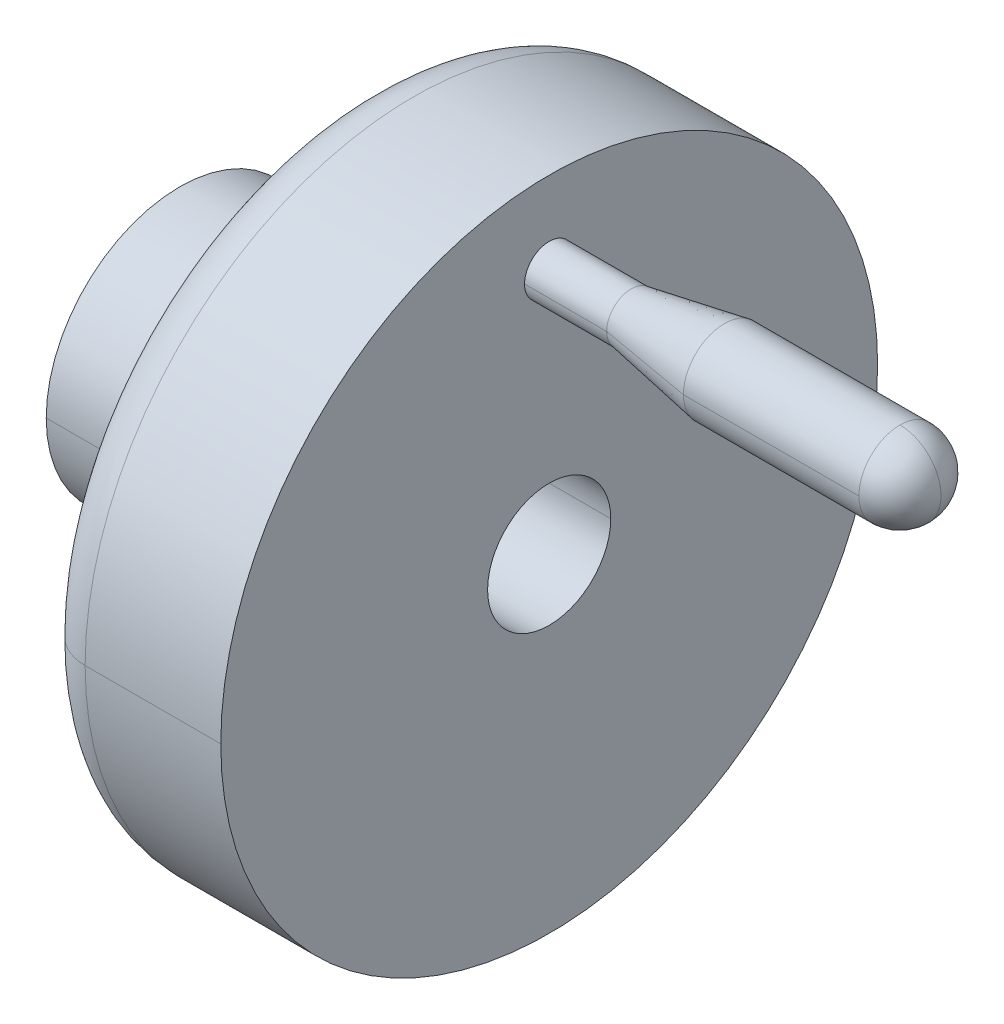
ISO-10303-21;
HEADER;
FILE_DESCRIPTION(('STEP AP214'),'2;1');
FILE_NAME('part.step','',(''),(''),'','','');
FILE_SCHEMA(('AUTOMOTIVE_DESIGN { 1 0 10303 214 1 1 1 1 }'));
ENDSEC;
DATA;
#1=APPLICATION_CONTEXT('core data for automotive mechanical design processes');
#2=APPLICATION_PROTOCOL_DEFINITION('international standard','automotive_design',2000,#1);
#3=PRODUCT_CONTEXT('',#1,'mechanical');
#4=PRODUCT('Part','Part','',(#3));
#5=PRODUCT_RELATED_PRODUCT_CATEGORY('part','',(#4));
#6=PRODUCT_DEFINITION_FORMATION('','',#4);
#7=PRODUCT_DEFINITION_CONTEXT('part definition',#1,'design');
#8=PRODUCT_DEFINITION('design','',#6,#7);
#9=PRODUCT_DEFINITION_SHAPE('','',#8);
#10=(LENGTH_UNIT() NAMED_UNIT(*) SI_UNIT(.MILLI.,.METRE.));
#11=(NAMED_UNIT(*) PLANE_ANGLE_UNIT() SI_UNIT($,.RADIAN.));
#12=(NAMED_UNIT(*) SI_UNIT($,.STERADIAN.) SOLID_ANGLE_UNIT());
#13=UNCERTAINTY_MEASURE_WITH_UNIT(LENGTH_MEASURE(1.E-05),#10,'distance_accuracy_value','');
#14=(GEOMETRIC_REPRESENTATION_CONTEXT(3) GLOBAL_UNCERTAINTY_ASSIGNED_CONTEXT((#13)) GLOBAL_UNIT_ASSIGNED_CONTEXT((#10,
#11,#12)) REPRESENTATION_CONTEXT('',''));
#15=CARTESIAN_POINT('',(0.,0.,0.));
#16=DIRECTION('',(0.,0.,1.));
#17=DIRECTION('',(1.,0.,0.));
#18=AXIS2_PLACEMENT_3D('',#15,#16,#17);
#19=CARTESIAN_POINT('',(18.3896,0.,0.));
#20=DIRECTION('',(1.,0.,0.));
#21=DIRECTION('',(0.,0.,-1.));
#22=AXIS2_PLACEMENT_3D('',#19,#20,#21);
#23=TOROIDAL_SURFACE('',#22,14.1351,3.81);
#24=CARTESIAN_POINT('',(18.3896,0.,14.1351));
#25=DIRECTION('',(0.,1.,0.));
#26=DIRECTION('',(0.,0.,1.));
#27=AXIS2_PLACEMENT_3D('',#24,#25,#26);
#28=CIRCLE('',#27,3.81);
#29=CARTESIAN_POINT('',(22.1996,0.,14.1351));
#30=VERTEX_POINT('',#29);
#31=CARTESIAN_POINT('',(18.3896,0.,10.3251));
#32=VERTEX_POINT('',#31);
#33=EDGE_CURVE('E331',#30,#32,#28,.T.);
#34=ORIENTED_EDGE('',*,*,#33,.F.);
#35=CARTESIAN_POINT('',(22.1996,0.,0.));
#36=DIRECTION('',(1.,0.,0.));
#37=DIRECTION('',(0.,0.,-1.));
#38=AXIS2_PLACEMENT_3D('',#35,#36,#37);
#39=CIRCLE('',#38,14.1351);
#40=CARTESIAN_POINT('',(22.1996,0.,-14.1351));
#41=VERTEX_POINT('',#40);
#42=EDGE_CURVE('E178',#41,#30,#39,.T.);
#43=ORIENTED_EDGE('',*,*,#42,.F.);
#44=CARTESIAN_POINT('',(18.3896,0.,-14.1351));
#45=DIRECTION('',(0.,-1.,0.));
#46=DIRECTION('',(0.,0.,-1.));
#47=AXIS2_PLACEMENT_3D('',#44,#45,#46);
#48=CIRCLE('',#47,3.81);
#49=CARTESIAN_POINT('',(18.3896,0.,-10.3251));
#50=VERTEX_POINT('',#49);
#51=EDGE_CURVE('E293',#41,#50,#48,.T.);
#52=ORIENTED_EDGE('',*,*,#51,.T.);
#53=CARTESIAN_POINT('',(18.3896,0.,0.));
#54=DIRECTION('',(-1.,0.,0.));
#55=DIRECTION('',(0.,0.,-1.));
#56=AXIS2_PLACEMENT_3D('',#53,#54,#55);
#57=CIRCLE('',#56,10.3251);
#58=EDGE_CURVE('E166',#32,#50,#57,.T.);
#59=ORIENTED_EDGE('',*,*,#58,.F.);
#60=EDGE_LOOP('',(#34,#43,#52,#59));
#61=FACE_BOUND('',#60,.T.);
#62=ADVANCED_FACE('F16',(#61),#23,.F.);
#63=CARTESIAN_POINT('',(26.0096,0.,0.));
#64=DIRECTION('',(1.,0.,0.));
#65=DIRECTION('',(0.,0.,-1.));
#66=AXIS2_PLACEMENT_3D('',#63,#64,#65);
#67=TOROIDAL_SURFACE('',#66,21.59,3.81);
#68=CARTESIAN_POINT('',(26.0096,0.,21.59));
#69=DIRECTION('',(0.,1.,0.));
#70=DIRECTION('',(0.,0.,1.));
#71=AXIS2_PLACEMENT_3D('',#68,#69,#70);
#72=CIRCLE('',#71,3.81);
#73=CARTESIAN_POINT('',(22.1996,0.,21.59));
#74=VERTEX_POINT('',#73);
#75=CARTESIAN_POINT('',(26.0096,0.,25.4));
#76=VERTEX_POINT('',#75);
#77=EDGE_CURVE('E278',#74,#76,#72,.T.);
#78=ORIENTED_EDGE('',*,*,#77,.F.);
#79=CARTESIAN_POINT('',(22.1996,0.,0.));
#80=DIRECTION('',(-1.,0.,0.));
#81=DIRECTION('',(0.,0.,-1.));
#82=AXIS2_PLACEMENT_3D('',#79,#80,#81);
#83=CIRCLE('',#82,21.59);
#84=CARTESIAN_POINT('',(22.1996,0.,-21.59));
#85=VERTEX_POINT('',#84);
#86=EDGE_CURVE('E183',#85,#74,#83,.T.);
#87=ORIENTED_EDGE('',*,*,#86,.F.);
#88=CARTESIAN_POINT('',(26.0096,0.,-21.59));
#89=DIRECTION('',(0.,-1.,0.));
#90=DIRECTION('',(0.,0.,-1.));
#91=AXIS2_PLACEMENT_3D('',#88,#89,#90);
#92=CIRCLE('',#91,3.81);
#93=CARTESIAN_POINT('',(26.0096,0.,-25.4));
#94=VERTEX_POINT('',#93);
#95=EDGE_CURVE('E277',#85,#94,#92,.T.);
#96=ORIENTED_EDGE('',*,*,#95,.T.);
#97=CARTESIAN_POINT('',(26.0096,0.,0.));
#98=DIRECTION('',(1.,0.,0.));
#99=DIRECTION('',(0.,0.,-1.));
#100=AXIS2_PLACEMENT_3D('',#97,#98,#99);
#101=CIRCLE('',#100,25.4);
#102=EDGE_CURVE('E145',#76,#94,#101,.T.);
#103=ORIENTED_EDGE('',*,*,#102,.F.);
#104=EDGE_LOOP('',(#78,#87,#96,#103));
#105=FACE_BOUND('',#104,.T.);
#106=ADVANCED_FACE('F348',(#105),#67,.T.);
#107=CARTESIAN_POINT('',(63.627,19.05,0.));
#108=DIRECTION('',(0.,0.,-1.));
#109=DIRECTION('',(0.,1.,0.));
#110=AXIS2_PLACEMENT_3D('',#107,#108,#109);
#111=SPHERICAL_SURFACE('',#110,3.175);
#112=CARTESIAN_POINT('',(63.627,19.05,0.));
#113=DIRECTION('',(0.,0.,-1.));
#114=DIRECTION('',(0.,1.,0.));
#115=AXIS2_PLACEMENT_3D('',#112,#113,#114);
#116=CIRCLE('',#115,3.175);
#117=CARTESIAN_POINT('',(66.802,19.05,0.));
#118=VERTEX_POINT('',#117);
#119=CARTESIAN_POINT('',(63.627,15.875,0.));
#120=VERTEX_POINT('',#119);
#121=EDGE_CURVE('E311',#118,#120,#116,.T.);
#122=ORIENTED_EDGE('',*,*,#121,.F.);
#123=CARTESIAN_POINT('',(63.627,19.05,0.));
#124=DIRECTION('',(0.,0.,1.));
#125=DIRECTION('',(1.,0.,0.));
#126=AXIS2_PLACEMENT_3D('',#123,#124,#125);
#127=CIRCLE('',#126,3.175);
#128=CARTESIAN_POINT('',(63.627,22.225,0.));
#129=VERTEX_POINT('',#128);
#130=EDGE_CURVE('E308',#118,#129,#127,.T.);
#131=ORIENTED_EDGE('',*,*,#130,.T.);
#132=CARTESIAN_POINT('',(63.627,19.05,0.));
#133=DIRECTION('',(-1.,0.,0.));
#134=DIRECTION('',(0.,0.,1.));
#135=AXIS2_PLACEMENT_3D('',#132,#133,#134);
#136=CIRCLE('',#135,3.175);
#137=CARTESIAN_POINT('',(63.627,19.05,3.175));
#138=VERTEX_POINT('',#137);
#139=EDGE_CURVE('E227',#138,#129,#136,.T.);
#140=ORIENTED_EDGE('',*,*,#139,.F.);
#141=CARTESIAN_POINT('',(63.627,19.05,0.));
#142=DIRECTION('',(-1.,0.,0.));
#143=DIRECTION('',(0.,0.,1.));
#144=AXIS2_PLACEMENT_3D('',#141,#142,#143);
#145=CIRCLE('',#144,3.175);
#146=EDGE_CURVE('E11',#120,#138,#145,.T.);
#147=ORIENTED_EDGE('',*,*,#146,.F.);
#148=EDGE_LOOP('',(#122,#131,#140,#147));
#149=FACE_BOUND('',#148,.T.);
#150=ADVANCED_FACE('F350',(#149),#111,.T.);
#151=CARTESIAN_POINT('',(14.8870282901346,19.05,0.));
#152=DIRECTION('',(-1.,0.,0.));
#153=DIRECTION('',(0.,0.,1.));
#154=AXIS2_PLACEMENT_3D('',#151,#152,#153);
#155=CYLINDRICAL_SURFACE('',#154,3.175);
#156=DIRECTION('',(-1.,0.,0.));
#157=VECTOR('',#156,1.);
#158=CARTESIAN_POINT('',(14.8870282901346,19.05,-3.175));
#159=LINE('',#158,#157);
#160=CARTESIAN_POINT('',(63.627,19.05,-3.175));
#161=VERTEX_POINT('',#160);
#162=CARTESIAN_POINT('',(50.0523279109145,19.05,-3.175));
#163=VERTEX_POINT('',#162);
#164=EDGE_CURVE('E219',#161,#163,#159,.T.);
#165=ORIENTED_EDGE('',*,*,#164,.F.);
#166=CARTESIAN_POINT('',(63.627,19.05,0.));
#167=DIRECTION('',(-1.,0.,0.));
#168=DIRECTION('',(0.,0.,1.));
#169=AXIS2_PLACEMENT_3D('',#166,#167,#168);
#170=CIRCLE('',#169,3.175);
#171=EDGE_CURVE('E231',#161,#120,#170,.T.);
#172=ORIENTED_EDGE('',*,*,#171,.T.);
#173=ORIENTED_EDGE('',*,*,#146,.T.);
#174=DIRECTION('',(-1.,0.,0.));
#175=VECTOR('',#174,1.);
#176=CARTESIAN_POINT('',(14.8870282901346,19.05,3.175));
#177=LINE('',#176,#175);
#178=CARTESIAN_POINT('',(50.0523279109145,19.05,3.175));
#179=VERTEX_POINT('',#178);
#180=EDGE_CURVE('E210',#138,#179,#177,.T.);
#181=ORIENTED_EDGE('',*,*,#180,.T.);
#182=CARTESIAN_POINT('',(50.0523279109145,19.05,0.));
#183=DIRECTION('',(-1.,0.,0.));
#184=DIRECTION('',(0.,0.,1.));
#185=AXIS2_PLACEMENT_3D('',#182,#183,#184);
#186=CIRCLE('',#185,3.175);
#187=EDGE_CURVE('E24',#163,#179,#186,.T.);
#188=ORIENTED_EDGE('',*,*,#187,.F.);
#189=EDGE_LOOP('',(#165,#172,#173,#181,#188));
#190=FACE_BOUND('',#189,.T.);
#191=ADVANCED_FACE('F211',(#190),#155,.T.);
#192=CARTESIAN_POINT('',(50.0523279109145,19.05,0.));
#193=DIRECTION('',(1.,0.,0.));
#194=DIRECTION('',(0.,0.,-1.));
#195=AXIS2_PLACEMENT_3D('',#192,#193,#194);
#196=CONICAL_SURFACE('',#195,3.175,0.174532925199434);
#197=DIRECTION('',(0.984807753012208,0.,0.173648177666931));
#198=VECTOR('',#197,1.);
#199=CARTESIAN_POINT('',(50.0523279109145,19.05,3.175));
#200=LINE('',#199,#198);
#201=CARTESIAN_POINT('',(42.8498,19.05,1.905));
#202=VERTEX_POINT('',#201);
#203=EDGE_CURVE('E193',#202,#179,#200,.T.);
#204=ORIENTED_EDGE('',*,*,#203,.F.);
#205=CARTESIAN_POINT('',(42.8498,19.05,0.));
#206=DIRECTION('',(-1.,0.,0.));
#207=DIRECTION('',(0.,0.,1.));
#208=AXIS2_PLACEMENT_3D('',#205,#206,#207);
#209=CIRCLE('',#208,1.905);
#210=CARTESIAN_POINT('',(42.8498,19.05,-1.905));
#211=VERTEX_POINT('',#210);
#212=EDGE_CURVE('E182',#211,#202,#209,.T.);
#213=ORIENTED_EDGE('',*,*,#212,.F.);
#214=DIRECTION('',(0.984807753012208,0.,-0.173648177666931));
#215=VECTOR('',#214,1.);
#216=CARTESIAN_POINT('',(50.0523279109145,19.05,-3.175));
#217=LINE('',#216,#215);
#218=EDGE_CURVE('E196',#211,#163,#217,.T.);
#219=ORIENTED_EDGE('',*,*,#218,.T.);
#220=ORIENTED_EDGE('',*,*,#187,.T.);
#221=EDGE_LOOP('',(#204,#213,#219,#220));
#222=FACE_BOUND('',#221,.T.);
#223=ADVANCED_FACE('F192',(#222),#196,.T.);
#224=CARTESIAN_POINT('',(14.8870282901346,19.05,0.));
#225=DIRECTION('',(-1.,0.,0.));
#226=DIRECTION('',(0.,0.,1.));
#227=AXIS2_PLACEMENT_3D('',#224,#225,#226);
#228=CYLINDRICAL_SURFACE('',#227,1.905);
#229=DIRECTION('',(-1.,0.,0.));
#230=VECTOR('',#229,1.);
#231=CARTESIAN_POINT('',(14.8870282901346,19.05,-1.905));
#232=LINE('',#231,#230);
#233=CARTESIAN_POINT('',(36.4998,19.05,-1.905));
#234=VERTEX_POINT('',#233);
#235=EDGE_CURVE('E240',#211,#234,#232,.T.);
#236=ORIENTED_EDGE('',*,*,#235,.F.);
#237=ORIENTED_EDGE('',*,*,#212,.T.);
#238=DIRECTION('',(-1.,0.,0.));
#239=VECTOR('',#238,1.);
#240=CARTESIAN_POINT('',(14.8870282901346,19.05,1.905));
#241=LINE('',#240,#239);
#242=CARTESIAN_POINT('',(36.4998,19.05,1.905));
#243=VERTEX_POINT('',#242);
#244=EDGE_CURVE('E248',#202,#243,#241,.T.);
#245=ORIENTED_EDGE('',*,*,#244,.T.);
#246=CARTESIAN_POINT('',(36.4998,19.05,0.));
#247=DIRECTION('',(1.,0.,0.));
#248=DIRECTION('',(0.,0.,1.));
#249=AXIS2_PLACEMENT_3D('',#246,#247,#248);
#250=CIRCLE('',#249,1.905);
#251=EDGE_CURVE('E236',#243,#234,#250,.T.);
#252=ORIENTED_EDGE('',*,*,#251,.T.);
#253=EDGE_LOOP('',(#236,#237,#245,#252));
#254=FACE_BOUND('',#253,.T.);
#255=ADVANCED_FACE('F364',(#254),#228,.T.);
#256=CARTESIAN_POINT('',(22.1996,10.3251,0.));
#257=DIRECTION('',(1.,0.,0.));
#258=DIRECTION('',(0.,1.,0.));
#259=AXIS2_PLACEMENT_3D('',#256,#257,#258);
#260=PLANE('',#259);
#261=ORIENTED_EDGE('',*,*,#42,.T.);
#262=CARTESIAN_POINT('',(22.1996,0.,0.));
#263=DIRECTION('',(1.,0.,0.));
#264=DIRECTION('',(0.,0.,-1.));
#265=AXIS2_PLACEMENT_3D('',#262,#263,#264);
#266=CIRCLE('',#265,14.1351);
#267=EDGE_CURVE('E328',#30,#41,#266,.T.);
#268=ORIENTED_EDGE('',*,*,#267,.T.);
#269=EDGE_LOOP('',(#261,#268));
#270=FACE_BOUND('',#269,.T.);
#271=ORIENTED_EDGE('',*,*,#86,.T.);
#272=CARTESIAN_POINT('',(22.1996,0.,0.));
#273=DIRECTION('',(-1.,0.,0.));
#274=DIRECTION('',(0.,0.,-1.));
#275=AXIS2_PLACEMENT_3D('',#272,#273,#274);
#276=CIRCLE('',#275,21.59);
#277=EDGE_CURVE('E284',#74,#85,#276,.T.);
#278=ORIENTED_EDGE('',*,*,#277,.T.);
#279=EDGE_LOOP('',(#271,#278));
#280=FACE_BOUND('',#279,.T.);
#281=ADVANCED_FACE('F347',(#270,#280),#260,.F.);
#282=CARTESIAN_POINT('',(-21.6680831826401,0.,0.));
#283=DIRECTION('',(-1.,0.,0.));
#284=DIRECTION('',(0.,0.,1.));
#285=AXIS2_PLACEMENT_3D('',#282,#283,#284);
#286=CYLINDRICAL_SURFACE('',#285,25.4);
#287=DIRECTION('',(-1.,0.,0.));
#288=VECTOR('',#287,1.);
#289=CARTESIAN_POINT('',(-21.6680831826401,0.,-25.4));
#290=LINE('',#289,#288);
#291=CARTESIAN_POINT('',(36.4998,0.,-25.4));
#292=VERTEX_POINT('',#291);
#293=EDGE_CURVE('E249',#292,#94,#290,.T.);
#294=ORIENTED_EDGE('',*,*,#293,.F.);
#295=CARTESIAN_POINT('',(36.4998,0.,0.));
#296=DIRECTION('',(-1.,0.,0.));
#297=DIRECTION('',(0.,0.,1.));
#298=AXIS2_PLACEMENT_3D('',#295,#296,#297);
#299=CIRCLE('',#298,25.4);
#300=CARTESIAN_POINT('',(36.4998,0.,25.4));
#301=VERTEX_POINT('',#300);
#302=EDGE_CURVE('E174',#292,#301,#299,.T.);
#303=ORIENTED_EDGE('',*,*,#302,.T.);
#304=DIRECTION('',(-1.,0.,0.));
#305=VECTOR('',#304,1.);
#306=CARTESIAN_POINT('',(-21.6680831826401,0.,25.4));
#307=LINE('',#306,#305);
#308=EDGE_CURVE('E160',#301,#76,#307,.T.);
#309=ORIENTED_EDGE('',*,*,#308,.T.);
#310=ORIENTED_EDGE('',*,*,#102,.T.);
#311=EDGE_LOOP('',(#294,#303,#309,#310));
#312=FACE_BOUND('',#311,.T.);
#313=ADVANCED_FACE('F264',(#312),#286,.T.);
#314=CARTESIAN_POINT('',(-21.6680831826401,0.,0.));
#315=DIRECTION('',(-1.,0.,0.));
#316=DIRECTION('',(0.,0.,1.));
#317=AXIS2_PLACEMENT_3D('',#314,#315,#316);
#318=CYLINDRICAL_SURFACE('',#317,4.7625);
#319=DIRECTION('',(-1.,0.,0.));
#320=VECTOR('',#319,1.);
#321=CARTESIAN_POINT('',(-21.6680831826401,0.,-4.7625));
#322=LINE('',#321,#320);
#323=CARTESIAN_POINT('',(36.4998,0.,-4.7625));
#324=VERTEX_POINT('',#323);
#325=CARTESIAN_POINT('',(7.9248,0.,-4.7625));
#326=VERTEX_POINT('',#325);
#327=EDGE_CURVE('E138',#324,#326,#322,.T.);
#328=ORIENTED_EDGE('',*,*,#327,.F.);
#329=CARTESIAN_POINT('',(36.4998,0.,0.));
#330=DIRECTION('',(-1.,0.,0.));
#331=DIRECTION('',(0.,0.,1.));
#332=AXIS2_PLACEMENT_3D('',#329,#330,#331);
#333=CIRCLE('',#332,4.7625);
#334=CARTESIAN_POINT('',(36.4998,0.,4.7625));
#335=VERTEX_POINT('',#334);
#336=EDGE_CURVE('E176',#335,#324,#333,.T.);
#337=ORIENTED_EDGE('',*,*,#336,.F.);
#338=DIRECTION('',(-1.,0.,0.));
#339=VECTOR('',#338,1.);
#340=CARTESIAN_POINT('',(-21.6680831826401,0.,4.7625));
#341=LINE('',#340,#339);
#342=CARTESIAN_POINT('',(7.9248,0.,4.7625));
#343=VERTEX_POINT('',#342);
#344=EDGE_CURVE('E141',#335,#343,#341,.T.);
#345=ORIENTED_EDGE('',*,*,#344,.T.);
#346=CARTESIAN_POINT('',(7.9248,0.,0.));
#347=DIRECTION('',(-1.,0.,0.));
#348=DIRECTION('',(0.,0.,1.));
#349=AXIS2_PLACEMENT_3D('',#346,#347,#348);
#350=CIRCLE('',#349,4.7625);
#351=EDGE_CURVE('E134',#343,#326,#350,.T.);
#352=ORIENTED_EDGE('',*,*,#351,.T.);
#353=EDGE_LOOP('',(#328,#337,#345,#352));
#354=FACE_BOUND('',#353,.T.);
#355=ADVANCED_FACE('F136',(#354),#318,.F.);
#356=CARTESIAN_POINT('',(7.9248,4.7625,0.));
#357=DIRECTION('',(1.,0.,0.));
#358=DIRECTION('',(0.,1.,0.));
#359=AXIS2_PLACEMENT_3D('',#356,#357,#358);
#360=PLANE('',#359);
#361=ORIENTED_EDGE('',*,*,#351,.F.);
#362=CARTESIAN_POINT('',(7.9248,0.,0.));
#363=DIRECTION('',(-1.,0.,0.));
#364=DIRECTION('',(0.,0.,1.));
#365=AXIS2_PLACEMENT_3D('',#362,#363,#364);
#366=CIRCLE('',#365,4.7625);
#367=EDGE_CURVE('E147',#326,#343,#366,.T.);
#368=ORIENTED_EDGE('',*,*,#367,.F.);
#369=EDGE_LOOP('',(#361,#368));
#370=FACE_BOUND('',#369,.T.);
#371=CARTESIAN_POINT('',(7.9248,0.,0.));
#372=DIRECTION('',(-1.,0.,0.));
#373=DIRECTION('',(0.,0.,1.));
#374=AXIS2_PLACEMENT_3D('',#371,#372,#373);
#375=CIRCLE('',#374,10.3251);
#376=CARTESIAN_POINT('',(7.9248,0.,10.3251));
#377=VERTEX_POINT('',#376);
#378=CARTESIAN_POINT('',(7.9248,0.,-10.3251));
#379=VERTEX_POINT('',#378);
#380=EDGE_CURVE('E167',#377,#379,#375,.T.);
#381=ORIENTED_EDGE('',*,*,#380,.T.);
#382=CARTESIAN_POINT('',(7.9248,0.,0.));
#383=DIRECTION('',(-1.,0.,0.));
#384=DIRECTION('',(0.,0.,1.));
#385=AXIS2_PLACEMENT_3D('',#382,#383,#384);
#386=CIRCLE('',#385,10.3251);
#387=EDGE_CURVE('E36',#379,#377,#386,.T.);
#388=ORIENTED_EDGE('',*,*,#387,.T.);
#389=EDGE_LOOP('',(#381,#388));
#390=FACE_BOUND('',#389,.T.);
#391=ADVANCED_FACE('F148',(#370,#390),#360,.F.);
#392=CARTESIAN_POINT('',(-21.6680831826401,0.,0.));
#393=DIRECTION('',(-1.,0.,0.));
#394=DIRECTION('',(0.,0.,1.));
#395=AXIS2_PLACEMENT_3D('',#392,#393,#394);
#396=CYLINDRICAL_SURFACE('',#395,10.3251);
#397=DIRECTION('',(-1.,0.,0.));
#398=VECTOR('',#397,1.);
#399=CARTESIAN_POINT('',(-21.6680831826401,0.,-10.3251));
#400=LINE('',#399,#398);
#401=EDGE_CURVE('E171',#50,#379,#400,.T.);
#402=ORIENTED_EDGE('',*,*,#401,.F.);
#403=CARTESIAN_POINT('',(18.3896,0.,0.));
#404=DIRECTION('',(-1.,0.,0.));
#405=DIRECTION('',(0.,0.,-1.));
#406=AXIS2_PLACEMENT_3D('',#403,#404,#405);
#407=CIRCLE('',#406,10.3251);
#408=EDGE_CURVE('E300',#50,#32,#407,.T.);
#409=ORIENTED_EDGE('',*,*,#408,.T.);
#410=DIRECTION('',(-1.,0.,0.));
#411=VECTOR('',#410,1.);
#412=CARTESIAN_POINT('',(-21.6680831826401,0.,10.3251));
#413=LINE('',#412,#411);
#414=EDGE_CURVE('E170',#32,#377,#413,.T.);
#415=ORIENTED_EDGE('',*,*,#414,.T.);
#416=ORIENTED_EDGE('',*,*,#387,.F.);
#417=EDGE_LOOP('',(#402,#409,#415,#416));
#418=FACE_BOUND('',#417,.T.);
#419=ADVANCED_FACE('F367',(#418),#396,.T.);
#420=CARTESIAN_POINT('',(36.4998,25.4,0.));
#421=DIRECTION('',(-1.,0.,0.));
#422=DIRECTION('',(0.,0.,1.));
#423=AXIS2_PLACEMENT_3D('',#420,#421,#422);
#424=PLANE('',#423);
#425=ORIENTED_EDGE('',*,*,#251,.F.);
#426=CARTESIAN_POINT('',(36.4998,19.05,0.));
#427=DIRECTION('',(1.,0.,0.));
#428=DIRECTION('',(0.,0.,1.));
#429=AXIS2_PLACEMENT_3D('',#426,#427,#428);
#430=CIRCLE('',#429,1.905);
#431=EDGE_CURVE('E244',#234,#243,#430,.T.);
#432=ORIENTED_EDGE('',*,*,#431,.F.);
#433=EDGE_LOOP('',(#425,#432));
#434=FACE_BOUND('',#433,.T.);
#435=ORIENTED_EDGE('',*,*,#336,.T.);
#436=CARTESIAN_POINT('',(36.4998,0.,0.));
#437=DIRECTION('',(-1.,0.,0.));
#438=DIRECTION('',(0.,0.,1.));
#439=AXIS2_PLACEMENT_3D('',#436,#437,#438);
#440=CIRCLE('',#439,4.7625);
#441=EDGE_CURVE('E154',#324,#335,#440,.T.);
#442=ORIENTED_EDGE('',*,*,#441,.T.);
#443=EDGE_LOOP('',(#435,#442));
#444=FACE_BOUND('',#443,.T.);
#445=CARTESIAN_POINT('',(36.4998,0.,0.));
#446=DIRECTION('',(-1.,0.,0.));
#447=DIRECTION('',(0.,0.,1.));
#448=AXIS2_PLACEMENT_3D('',#445,#446,#447);
#449=CIRCLE('',#448,25.4);
#450=EDGE_CURVE('E253',#301,#292,#449,.T.);
#451=ORIENTED_EDGE('',*,*,#450,.F.);
#452=ORIENTED_EDGE('',*,*,#302,.F.);
#453=EDGE_LOOP('',(#451,#452));
#454=FACE_BOUND('',#453,.T.);
#455=ADVANCED_FACE('F370',(#434,#444,#454),#424,.F.);
#456=CARTESIAN_POINT('',(-21.6680831826401,0.,0.));
#457=DIRECTION('',(-1.,0.,0.));
#458=DIRECTION('',(0.,0.,1.));
#459=AXIS2_PLACEMENT_3D('',#456,#457,#458);
#460=CYLINDRICAL_SURFACE('',#459,10.3251);
#461=ORIENTED_EDGE('',*,*,#58,.T.);
#462=ORIENTED_EDGE('',*,*,#401,.T.);
#463=ORIENTED_EDGE('',*,*,#380,.F.);
#464=ORIENTED_EDGE('',*,*,#414,.F.);
#465=EDGE_LOOP('',(#461,#462,#463,#464));
#466=FACE_BOUND('',#465,.T.);
#467=ADVANCED_FACE('F376',(#466),#460,.T.);
#468=CARTESIAN_POINT('',(-21.6680831826401,0.,0.));
#469=DIRECTION('',(-1.,0.,0.));
#470=DIRECTION('',(0.,0.,1.));
#471=AXIS2_PLACEMENT_3D('',#468,#469,#470);
#472=CYLINDRICAL_SURFACE('',#471,4.7625);
#473=ORIENTED_EDGE('',*,*,#441,.F.);
#474=ORIENTED_EDGE('',*,*,#327,.T.);
#475=ORIENTED_EDGE('',*,*,#367,.T.);
#476=ORIENTED_EDGE('',*,*,#344,.F.);
#477=EDGE_LOOP('',(#473,#474,#475,#476));
#478=FACE_BOUND('',#477,.T.);
#479=ADVANCED_FACE('F152',(#478),#472,.F.);
#480=CARTESIAN_POINT('',(-21.6680831826401,0.,0.));
#481=DIRECTION('',(-1.,0.,0.));
#482=DIRECTION('',(0.,0.,1.));
#483=AXIS2_PLACEMENT_3D('',#480,#481,#482);
#484=CYLINDRICAL_SURFACE('',#483,25.4);
#485=ORIENTED_EDGE('',*,*,#450,.T.);
#486=ORIENTED_EDGE('',*,*,#293,.T.);
#487=CARTESIAN_POINT('',(26.0096,0.,0.));
#488=DIRECTION('',(1.,0.,0.));
#489=DIRECTION('',(0.,0.,-1.));
#490=AXIS2_PLACEMENT_3D('',#487,#488,#489);
#491=CIRCLE('',#490,25.4);
#492=EDGE_CURVE('E270',#94,#76,#491,.T.);
#493=ORIENTED_EDGE('',*,*,#492,.T.);
#494=ORIENTED_EDGE('',*,*,#308,.F.);
#495=EDGE_LOOP('',(#485,#486,#493,#494));
#496=FACE_BOUND('',#495,.T.);
#497=ADVANCED_FACE('F272',(#496),#484,.T.);
#498=CARTESIAN_POINT('',(14.8870282901346,19.05,0.));
#499=DIRECTION('',(-1.,0.,0.));
#500=DIRECTION('',(0.,0.,1.));
#501=AXIS2_PLACEMENT_3D('',#498,#499,#500);
#502=CYLINDRICAL_SURFACE('',#501,1.905);
#503=CARTESIAN_POINT('',(42.8498,19.05,0.));
#504=DIRECTION('',(-1.,0.,0.));
#505=DIRECTION('',(0.,0.,1.));
#506=AXIS2_PLACEMENT_3D('',#503,#504,#505);
#507=CIRCLE('',#506,1.905);
#508=EDGE_CURVE('E206',#202,#211,#507,.T.);
#509=ORIENTED_EDGE('',*,*,#508,.T.);
#510=ORIENTED_EDGE('',*,*,#235,.T.);
#511=ORIENTED_EDGE('',*,*,#431,.T.);
#512=ORIENTED_EDGE('',*,*,#244,.F.);
#513=EDGE_LOOP('',(#509,#510,#511,#512));
#514=FACE_BOUND('',#513,.T.);
#515=ADVANCED_FACE('F385',(#514),#502,.T.);
#516=CARTESIAN_POINT('',(50.0523279109145,19.05,0.));
#517=DIRECTION('',(1.,0.,0.));
#518=DIRECTION('',(0.,0.,-1.));
#519=AXIS2_PLACEMENT_3D('',#516,#517,#518);
#520=CONICAL_SURFACE('',#519,3.175,0.174532925199434);
#521=ORIENTED_EDGE('',*,*,#508,.F.);
#522=ORIENTED_EDGE('',*,*,#203,.T.);
#523=CARTESIAN_POINT('',(50.0523279109145,19.05,0.));
#524=DIRECTION('',(-1.,0.,0.));
#525=DIRECTION('',(0.,0.,1.));
#526=AXIS2_PLACEMENT_3D('',#523,#524,#525);
#527=CIRCLE('',#526,3.175);
#528=EDGE_CURVE('E203',#179,#163,#527,.T.);
#529=ORIENTED_EDGE('',*,*,#528,.T.);
#530=ORIENTED_EDGE('',*,*,#218,.F.);
#531=EDGE_LOOP('',(#521,#522,#529,#530));
#532=FACE_BOUND('',#531,.T.);
#533=ADVANCED_FACE('F201',(#532),#520,.T.);
#534=CARTESIAN_POINT('',(14.8870282901346,19.05,0.));
#535=DIRECTION('',(-1.,0.,0.));
#536=DIRECTION('',(0.,0.,1.));
#537=AXIS2_PLACEMENT_3D('',#534,#535,#536);
#538=CYLINDRICAL_SURFACE('',#537,3.175);
#539=ORIENTED_EDGE('',*,*,#139,.T.);
#540=CARTESIAN_POINT('',(63.627,19.05,0.));
#541=DIRECTION('',(-1.,0.,0.));
#542=DIRECTION('',(0.,0.,1.));
#543=AXIS2_PLACEMENT_3D('',#540,#541,#542);
#544=CIRCLE('',#543,3.175);
#545=EDGE_CURVE('E233',#129,#161,#544,.T.);
#546=ORIENTED_EDGE('',*,*,#545,.T.);
#547=ORIENTED_EDGE('',*,*,#164,.T.);
#548=ORIENTED_EDGE('',*,*,#528,.F.);
#549=ORIENTED_EDGE('',*,*,#180,.F.);
#550=EDGE_LOOP('',(#539,#546,#547,#548,#549));
#551=FACE_BOUND('',#550,.T.);
#552=ADVANCED_FACE('F217',(#551),#538,.T.);
#553=CARTESIAN_POINT('',(63.627,19.05,0.));
#554=DIRECTION('',(0.,0.,-1.));
#555=DIRECTION('',(0.,1.,0.));
#556=AXIS2_PLACEMENT_3D('',#553,#554,#555);
#557=SPHERICAL_SURFACE('',#556,3.175);
#558=ORIENTED_EDGE('',*,*,#130,.F.);
#559=ORIENTED_EDGE('',*,*,#121,.T.);
#560=ORIENTED_EDGE('',*,*,#171,.F.);
#561=ORIENTED_EDGE('',*,*,#545,.F.);
#562=EDGE_LOOP('',(#558,#559,#560,#561));
#563=FACE_BOUND('',#562,.T.);
#564=ADVANCED_FACE('F395',(#563),#557,.T.);
#565=CARTESIAN_POINT('',(26.0096,0.,0.));
#566=DIRECTION('',(1.,0.,0.));
#567=DIRECTION('',(0.,0.,-1.));
#568=AXIS2_PLACEMENT_3D('',#565,#566,#567);
#569=TOROIDAL_SURFACE('',#568,21.59,3.81);
#570=ORIENTED_EDGE('',*,*,#277,.F.);
#571=ORIENTED_EDGE('',*,*,#77,.T.);
#572=ORIENTED_EDGE('',*,*,#492,.F.);
#573=ORIENTED_EDGE('',*,*,#95,.F.);
#574=EDGE_LOOP('',(#570,#571,#572,#573));
#575=FACE_BOUND('',#574,.T.);
#576=ADVANCED_FACE('F282',(#575),#569,.T.);
#577=CARTESIAN_POINT('',(18.3896,0.,0.));
#578=DIRECTION('',(1.,0.,0.));
#579=DIRECTION('',(0.,0.,-1.));
#580=AXIS2_PLACEMENT_3D('',#577,#578,#579);
#581=TOROIDAL_SURFACE('',#580,14.1351,3.81);
#582=ORIENTED_EDGE('',*,*,#267,.F.);
#583=ORIENTED_EDGE('',*,*,#33,.T.);
#584=ORIENTED_EDGE('',*,*,#408,.F.);
#585=ORIENTED_EDGE('',*,*,#51,.F.);
#586=EDGE_LOOP('',(#582,#583,#584,#585));
#587=FACE_BOUND('',#586,.T.);
#588=ADVANCED_FACE('F401',(#587),#581,.F.);
#589=CLOSED_SHELL('',(#62,#106,#150,#191,#223,#255,#281,#313,#355,#391,#419,#455,#467,#479,#497,
#515,#533,#552,#564,#576,#588));
#590=MANIFOLD_SOLID_BREP('B1',#589);
#591=ADVANCED_BREP_SHAPE_REPRESENTATION('',(#18,#590),#14);
#592=SHAPE_DEFINITION_REPRESENTATION(#9,#591);
ENDSEC;
END-ISO-10303-21;
